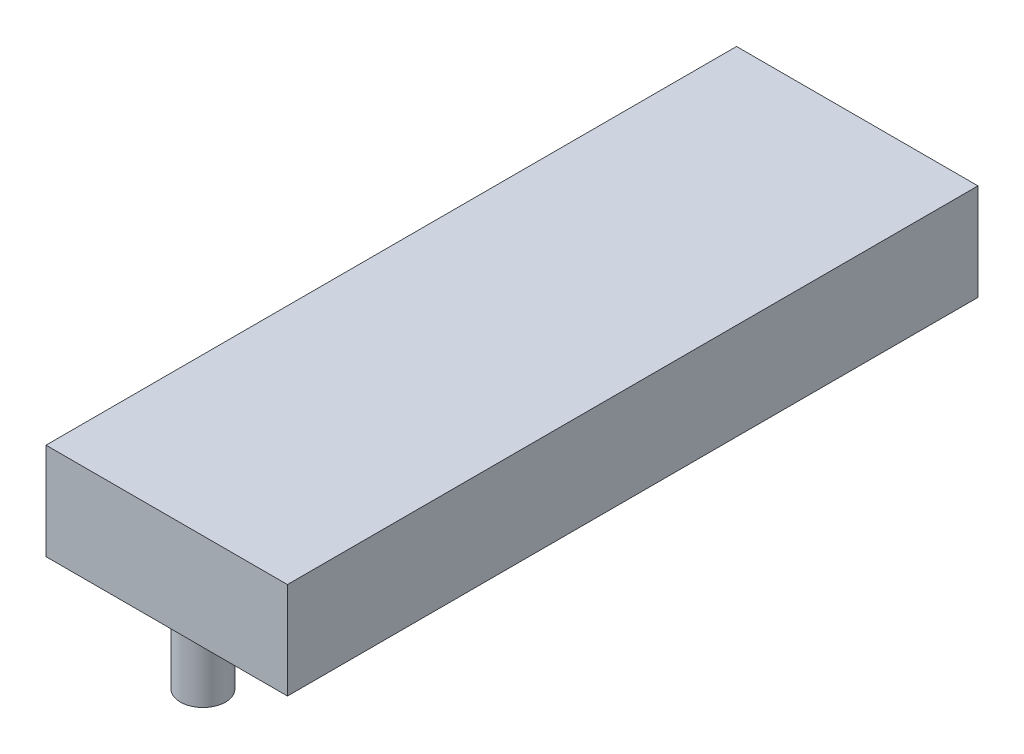
ISO-10303-21;
HEADER;
FILE_DESCRIPTION(('STEP AP214'),'2;1');
FILE_NAME('part.step','',(''),(''),'','','');
FILE_SCHEMA(('AUTOMOTIVE_DESIGN { 1 0 10303 214 1 1 1 1 }'));
ENDSEC;
DATA;
#1=APPLICATION_CONTEXT('core data for automotive mechanical design processes');
#2=APPLICATION_PROTOCOL_DEFINITION('international standard','automotive_design',2000,#1);
#3=PRODUCT_CONTEXT('',#1,'mechanical');
#4=PRODUCT('Part','Part','',(#3));
#5=PRODUCT_RELATED_PRODUCT_CATEGORY('part','',(#4));
#6=PRODUCT_DEFINITION_FORMATION('','',#4);
#7=PRODUCT_DEFINITION_CONTEXT('part definition',#1,'design');
#8=PRODUCT_DEFINITION('design','',#6,#7);
#9=PRODUCT_DEFINITION_SHAPE('','',#8);
#10=(LENGTH_UNIT() NAMED_UNIT(*) SI_UNIT(.MILLI.,.METRE.));
#11=(NAMED_UNIT(*) PLANE_ANGLE_UNIT() SI_UNIT($,.RADIAN.));
#12=(NAMED_UNIT(*) SI_UNIT($,.STERADIAN.) SOLID_ANGLE_UNIT());
#13=UNCERTAINTY_MEASURE_WITH_UNIT(LENGTH_MEASURE(1.E-05),#10,'distance_accuracy_value','');
#14=(GEOMETRIC_REPRESENTATION_CONTEXT(3) GLOBAL_UNCERTAINTY_ASSIGNED_CONTEXT((#13)) GLOBAL_UNIT_ASSIGNED_CONTEXT((#10,
#11,#12)) REPRESENTATION_CONTEXT('',''));
#15=CARTESIAN_POINT('',(0.,0.,0.));
#16=DIRECTION('',(0.,0.,1.));
#17=DIRECTION('',(1.,0.,0.));
#18=AXIS2_PLACEMENT_3D('',#15,#16,#17);
#19=CARTESIAN_POINT('',(5.,4.,14.3));
#20=DIRECTION('',(-1.,0.,0.));
#21=DIRECTION('',(0.,0.,1.));
#22=AXIS2_PLACEMENT_3D('',#19,#20,#21);
#23=PLANE('',#22);
#24=DIRECTION('',(0.,0.,-1.));
#25=VECTOR('',#24,1.);
#26=CARTESIAN_POINT('',(5.,0.,14.3));
#27=LINE('',#26,#25);
#28=CARTESIAN_POINT('',(5.,0.,14.3));
#29=VERTEX_POINT('',#28);
#30=CARTESIAN_POINT('',(5.,0.,-14.3));
#31=VERTEX_POINT('',#30);
#32=EDGE_CURVE('E100',#29,#31,#27,.T.);
#33=ORIENTED_EDGE('',*,*,#32,.T.);
#34=DIRECTION('',(0.,-1.,0.));
#35=VECTOR('',#34,1.);
#36=CARTESIAN_POINT('',(5.,4.,-14.3));
#37=LINE('',#36,#35);
#38=CARTESIAN_POINT('',(5.,4.,-14.3));
#39=VERTEX_POINT('',#38);
#40=EDGE_CURVE('E11',#39,#31,#37,.T.);
#41=ORIENTED_EDGE('',*,*,#40,.F.);
#42=DIRECTION('',(0.,0.,-1.));
#43=VECTOR('',#42,1.);
#44=CARTESIAN_POINT('',(5.,4.,14.3));
#45=LINE('',#44,#43);
#46=CARTESIAN_POINT('',(5.,4.,14.3));
#47=VERTEX_POINT('',#46);
#48=EDGE_CURVE('E88',#47,#39,#45,.T.);
#49=ORIENTED_EDGE('',*,*,#48,.F.);
#50=DIRECTION('',(0.,-1.,0.));
#51=VECTOR('',#50,1.);
#52=CARTESIAN_POINT('',(5.,4.,14.3));
#53=LINE('',#52,#51);
#54=EDGE_CURVE('E96',#47,#29,#53,.T.);
#55=ORIENTED_EDGE('',*,*,#54,.T.);
#56=EDGE_LOOP('',(#33,#41,#49,#55));
#57=FACE_BOUND('',#56,.T.);
#58=ADVANCED_FACE('F37',(#57),#23,.F.);
#59=CARTESIAN_POINT('',(-5.,4.,-14.3));
#60=DIRECTION('',(0.,0.,1.));
#61=DIRECTION('',(1.,0.,0.));
#62=AXIS2_PLACEMENT_3D('',#59,#60,#61);
#63=PLANE('',#62);
#64=DIRECTION('',(-1.,0.,0.));
#65=VECTOR('',#64,1.);
#66=CARTESIAN_POINT('',(-5.,0.,-14.3));
#67=LINE('',#66,#65);
#68=CARTESIAN_POINT('',(-5.,0.,-14.3));
#69=VERTEX_POINT('',#68);
#70=EDGE_CURVE('E92',#31,#69,#67,.T.);
#71=ORIENTED_EDGE('',*,*,#70,.T.);
#72=DIRECTION('',(0.,-1.,0.));
#73=VECTOR('',#72,1.);
#74=CARTESIAN_POINT('',(-5.,4.,-14.3));
#75=LINE('',#74,#73);
#76=CARTESIAN_POINT('',(-5.,4.,-14.3));
#77=VERTEX_POINT('',#76);
#78=EDGE_CURVE('E45',#77,#69,#75,.T.);
#79=ORIENTED_EDGE('',*,*,#78,.F.);
#80=DIRECTION('',(-1.,0.,0.));
#81=VECTOR('',#80,1.);
#82=CARTESIAN_POINT('',(-5.,4.,-14.3));
#83=LINE('',#82,#81);
#84=EDGE_CURVE('E83',#39,#77,#83,.T.);
#85=ORIENTED_EDGE('',*,*,#84,.F.);
#86=ORIENTED_EDGE('',*,*,#40,.T.);
#87=EDGE_LOOP('',(#71,#79,#85,#86));
#88=FACE_BOUND('',#87,.T.);
#89=ADVANCED_FACE('F91',(#88),#63,.F.);
#90=CARTESIAN_POINT('',(-5.,4.,14.3));
#91=DIRECTION('',(1.,0.,0.));
#92=DIRECTION('',(0.,0.,-1.));
#93=AXIS2_PLACEMENT_3D('',#90,#91,#92);
#94=PLANE('',#93);
#95=DIRECTION('',(0.,0.,1.));
#96=VECTOR('',#95,1.);
#97=CARTESIAN_POINT('',(-5.,0.,14.3));
#98=LINE('',#97,#96);
#99=CARTESIAN_POINT('',(-5.,0.,14.3));
#100=VERTEX_POINT('',#99);
#101=EDGE_CURVE('E70',#69,#100,#98,.T.);
#102=ORIENTED_EDGE('',*,*,#101,.T.);
#103=DIRECTION('',(0.,-1.,0.));
#104=VECTOR('',#103,1.);
#105=CARTESIAN_POINT('',(-5.,4.,14.3));
#106=LINE('',#105,#104);
#107=CARTESIAN_POINT('',(-5.,4.,14.3));
#108=VERTEX_POINT('',#107);
#109=EDGE_CURVE('E93',#108,#100,#106,.T.);
#110=ORIENTED_EDGE('',*,*,#109,.F.);
#111=DIRECTION('',(0.,0.,1.));
#112=VECTOR('',#111,1.);
#113=CARTESIAN_POINT('',(-5.,4.,14.3));
#114=LINE('',#113,#112);
#115=EDGE_CURVE('E86',#77,#108,#114,.T.);
#116=ORIENTED_EDGE('',*,*,#115,.F.);
#117=ORIENTED_EDGE('',*,*,#78,.T.);
#118=EDGE_LOOP('',(#102,#110,#116,#117));
#119=FACE_BOUND('',#118,.T.);
#120=ADVANCED_FACE('F94',(#119),#94,.F.);
#121=CARTESIAN_POINT('',(-5.,4.,14.3));
#122=DIRECTION('',(0.,0.,-1.));
#123=DIRECTION('',(-1.,0.,0.));
#124=AXIS2_PLACEMENT_3D('',#121,#122,#123);
#125=PLANE('',#124);
#126=DIRECTION('',(1.,0.,0.));
#127=VECTOR('',#126,1.);
#128=CARTESIAN_POINT('',(-5.,0.,14.3));
#129=LINE('',#128,#127);
#130=EDGE_CURVE('E76',#100,#29,#129,.T.);
#131=ORIENTED_EDGE('',*,*,#130,.T.);
#132=ORIENTED_EDGE('',*,*,#54,.F.);
#133=DIRECTION('',(1.,0.,0.));
#134=VECTOR('',#133,1.);
#135=CARTESIAN_POINT('',(-5.,4.,14.3));
#136=LINE('',#135,#134);
#137=EDGE_CURVE('E53',#108,#47,#136,.T.);
#138=ORIENTED_EDGE('',*,*,#137,.F.);
#139=ORIENTED_EDGE('',*,*,#109,.T.);
#140=EDGE_LOOP('',(#131,#132,#138,#139));
#141=FACE_BOUND('',#140,.T.);
#142=ADVANCED_FACE('F108',(#141),#125,.F.);
#143=CARTESIAN_POINT('',(0.,4.,0.));
#144=DIRECTION('',(0.,-1.,0.));
#145=DIRECTION('',(0.,0.,-1.));
#146=AXIS2_PLACEMENT_3D('',#143,#144,#145);
#147=PLANE('',#146);
#148=ORIENTED_EDGE('',*,*,#48,.T.);
#149=ORIENTED_EDGE('',*,*,#84,.T.);
#150=ORIENTED_EDGE('',*,*,#115,.T.);
#151=ORIENTED_EDGE('',*,*,#137,.T.);
#152=EDGE_LOOP('',(#148,#149,#150,#151));
#153=FACE_BOUND('',#152,.T.);
#154=ADVANCED_FACE('F84',(#153),#147,.F.);
#155=CARTESIAN_POINT('',(0.,0.,0.));
#156=DIRECTION('',(0.,-1.,0.));
#157=DIRECTION('',(0.,0.,-1.));
#158=AXIS2_PLACEMENT_3D('',#155,#156,#157);
#159=PLANE('',#158);
#160=CARTESIAN_POINT('',(0.,0.,-12.8));
#161=DIRECTION('',(0.,-1.,0.));
#162=DIRECTION('',(0.,0.,1.));
#163=AXIS2_PLACEMENT_3D('',#160,#161,#162);
#164=CIRCLE('',#163,0.935);
#165=CARTESIAN_POINT('',(0.,0.,-11.865));
#166=VERTEX_POINT('',#165);
#167=EDGE_CURVE('E117',#166,#166,#164,.T.);
#168=ORIENTED_EDGE('',*,*,#167,.F.);
#169=EDGE_LOOP('',(#168));
#170=FACE_BOUND('',#169,.T.);
#171=CARTESIAN_POINT('',(0.,0.,12.8));
#172=DIRECTION('',(0.,-1.,0.));
#173=DIRECTION('',(0.,0.,-1.));
#174=AXIS2_PLACEMENT_3D('',#171,#172,#173);
#175=CIRCLE('',#174,0.935);
#176=CARTESIAN_POINT('',(0.,0.,11.865));
#177=VERTEX_POINT('',#176);
#178=EDGE_CURVE('E114',#177,#177,#175,.T.);
#179=ORIENTED_EDGE('',*,*,#178,.F.);
#180=EDGE_LOOP('',(#179));
#181=FACE_BOUND('',#180,.T.);
#182=ORIENTED_EDGE('',*,*,#32,.F.);
#183=ORIENTED_EDGE('',*,*,#130,.F.);
#184=ORIENTED_EDGE('',*,*,#101,.F.);
#185=ORIENTED_EDGE('',*,*,#70,.F.);
#186=EDGE_LOOP('',(#182,#183,#184,#185));
#187=FACE_BOUND('',#186,.T.);
#188=ADVANCED_FACE('F111',(#170,#181,#187),#159,.T.);
#189=CARTESIAN_POINT('',(0.,-3.,12.8));
#190=DIRECTION('',(0.,1.,0.));
#191=DIRECTION('',(0.,0.,1.));
#192=AXIS2_PLACEMENT_3D('',#189,#190,#191);
#193=CYLINDRICAL_SURFACE('',#192,0.935);
#194=CARTESIAN_POINT('',(0.,-3.,12.8));
#195=DIRECTION('',(0.,-1.,0.));
#196=DIRECTION('',(0.,0.,-1.));
#197=AXIS2_PLACEMENT_3D('',#194,#195,#196);
#198=CIRCLE('',#197,0.935);
#199=CARTESIAN_POINT('',(0.,-3.,11.865));
#200=VERTEX_POINT('',#199);
#201=EDGE_CURVE('E103',#200,#200,#198,.T.);
#202=ORIENTED_EDGE('',*,*,#201,.F.);
#203=EDGE_LOOP('',(#202));
#204=FACE_BOUND('',#203,.T.);
#205=ORIENTED_EDGE('',*,*,#178,.T.);
#206=EDGE_LOOP('',(#205));
#207=FACE_BOUND('',#206,.T.);
#208=ADVANCED_FACE('F130',(#204,#207),#193,.T.);
#209=CARTESIAN_POINT('',(0.,-3.,12.8));
#210=DIRECTION('',(0.,-1.,0.));
#211=DIRECTION('',(0.,0.,-1.));
#212=AXIS2_PLACEMENT_3D('',#209,#210,#211);
#213=PLANE('',#212);
#214=ORIENTED_EDGE('',*,*,#201,.T.);
#215=EDGE_LOOP('',(#214));
#216=FACE_BOUND('',#215,.T.);
#217=ADVANCED_FACE('F135',(#216),#213,.T.);
#218=CARTESIAN_POINT('',(0.,-3.,-12.8));
#219=DIRECTION('',(0.,1.,0.));
#220=DIRECTION('',(0.,0.,1.));
#221=AXIS2_PLACEMENT_3D('',#218,#219,#220);
#222=CYLINDRICAL_SURFACE('',#221,0.935);
#223=CARTESIAN_POINT('',(0.,-3.,-12.8));
#224=DIRECTION('',(0.,-1.,0.));
#225=DIRECTION('',(0.,0.,1.));
#226=AXIS2_PLACEMENT_3D('',#223,#224,#225);
#227=CIRCLE('',#226,0.935);
#228=CARTESIAN_POINT('',(0.,-3.,-11.865));
#229=VERTEX_POINT('',#228);
#230=EDGE_CURVE('E120',#229,#229,#227,.T.);
#231=ORIENTED_EDGE('',*,*,#230,.F.);
#232=EDGE_LOOP('',(#231));
#233=FACE_BOUND('',#232,.T.);
#234=ORIENTED_EDGE('',*,*,#167,.T.);
#235=EDGE_LOOP('',(#234));
#236=FACE_BOUND('',#235,.T.);
#237=ADVANCED_FACE('F126',(#233,#236),#222,.T.);
#238=CARTESIAN_POINT('',(0.,-3.,-12.8));
#239=DIRECTION('',(0.,1.,0.));
#240=DIRECTION('',(0.,0.,1.));
#241=AXIS2_PLACEMENT_3D('',#238,#239,#240);
#242=PLANE('',#241);
#243=ORIENTED_EDGE('',*,*,#230,.T.);
#244=EDGE_LOOP('',(#243));
#245=FACE_BOUND('',#244,.T.);
#246=ADVANCED_FACE('F186',(#245),#242,.F.);
#247=CLOSED_SHELL('',(#58,#89,#120,#142,#154,#188,#208,#217,#237,#246));
#248=MANIFOLD_SOLID_BREP('B2',#247);
#249=ADVANCED_BREP_SHAPE_REPRESENTATION('',(#18,#248),#14);
#250=SHAPE_DEFINITION_REPRESENTATION(#9,#249);
ENDSEC;
END-ISO-10303-21;
